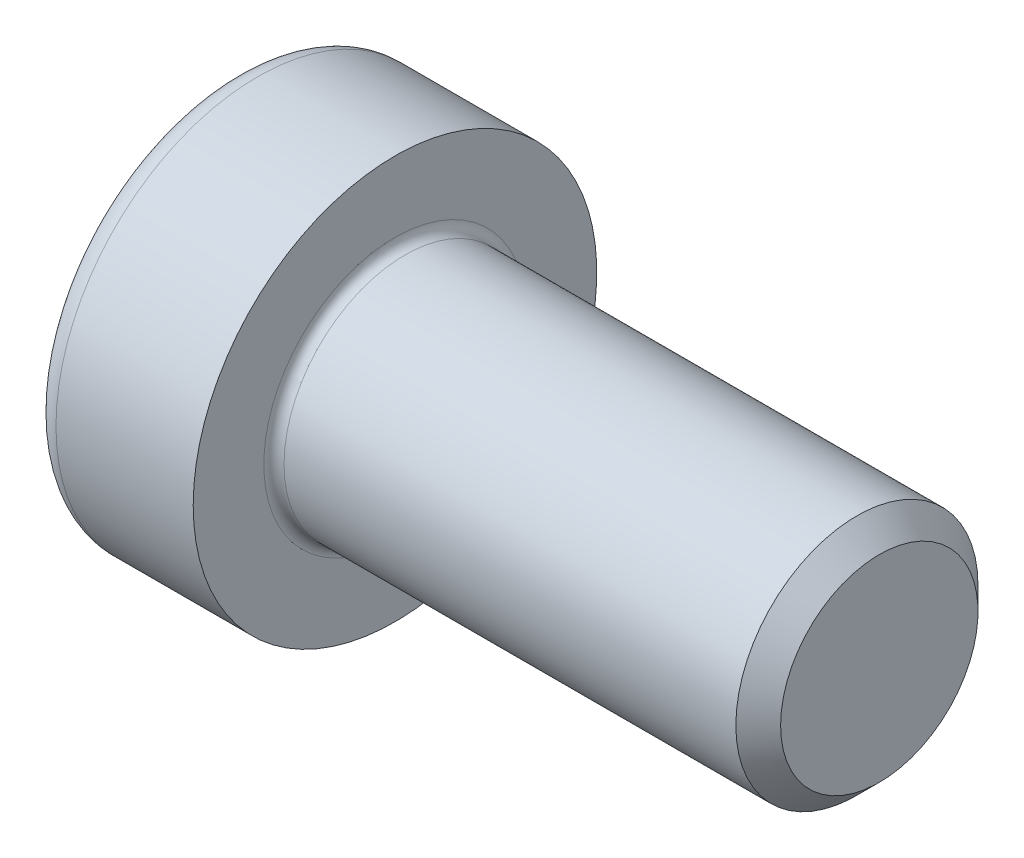
ISO-10303-21;
HEADER;
FILE_DESCRIPTION(('STEP AP214'),'2;1');
FILE_NAME('part.step','',(''),(''),'','','');
FILE_SCHEMA(('AUTOMOTIVE_DESIGN { 1 0 10303 214 1 1 1 1 }'));
ENDSEC;
DATA;
#1=APPLICATION_CONTEXT('core data for automotive mechanical design processes');
#2=APPLICATION_PROTOCOL_DEFINITION('international standard','automotive_design',2000,#1);
#3=PRODUCT_CONTEXT('',#1,'mechanical');
#4=PRODUCT('Part','Part','',(#3));
#5=PRODUCT_RELATED_PRODUCT_CATEGORY('part','',(#4));
#6=PRODUCT_DEFINITION_FORMATION('','',#4);
#7=PRODUCT_DEFINITION_CONTEXT('part definition',#1,'design');
#8=PRODUCT_DEFINITION('design','',#6,#7);
#9=PRODUCT_DEFINITION_SHAPE('','',#8);
#10=(LENGTH_UNIT() NAMED_UNIT(*) SI_UNIT(.MILLI.,.METRE.));
#11=(NAMED_UNIT(*) PLANE_ANGLE_UNIT() SI_UNIT($,.RADIAN.));
#12=(NAMED_UNIT(*) SI_UNIT($,.STERADIAN.) SOLID_ANGLE_UNIT());
#13=UNCERTAINTY_MEASURE_WITH_UNIT(LENGTH_MEASURE(1.E-05),#10,'distance_accuracy_value','');
#14=(GEOMETRIC_REPRESENTATION_CONTEXT(3) GLOBAL_UNCERTAINTY_ASSIGNED_CONTEXT((#13)) GLOBAL_UNIT_ASSIGNED_CONTEXT((#10,
#11,#12)) REPRESENTATION_CONTEXT('',''));
#15=CARTESIAN_POINT('',(0.,0.,0.));
#16=DIRECTION('',(0.,0.,1.));
#17=DIRECTION('',(1.,0.,0.));
#18=AXIS2_PLACEMENT_3D('',#15,#16,#17);
#19=CARTESIAN_POINT('',(2.5,1.44337567297407,2.49999999999999));
#20=DIRECTION('',(-1.,0.,0.));
#21=DIRECTION('',(0.,0.,1.));
#22=AXIS2_PLACEMENT_3D('',#19,#20,#21);
#23=PLANE('',#22);
#24=CARTESIAN_POINT('',(2.5,0.,0.));
#25=DIRECTION('',(-1.,0.,0.));
#26=DIRECTION('',(0.,0.,1.));
#27=AXIS2_PLACEMENT_3D('',#24,#25,#26);
#28=CIRCLE('',#27,2.5);
#29=CARTESIAN_POINT('',(2.5,0.,2.5));
#30=VERTEX_POINT('',#29);
#31=CARTESIAN_POINT('',(2.5,2.1650635094611,1.24999999999999));
#32=VERTEX_POINT('',#31);
#33=EDGE_CURVE('E121',#30,#32,#28,.T.);
#34=ORIENTED_EDGE('',*,*,#33,.F.);
#35=DIRECTION('',(0.,1.,0.));
#36=VECTOR('',#35,1.);
#37=CARTESIAN_POINT('',(2.5,-1.44337567297405,2.5));
#38=LINE('',#37,#36);
#39=CARTESIAN_POINT('',(2.5,1.44337567297408,2.49999999999999));
#40=VERTEX_POINT('',#39);
#41=EDGE_CURVE('E128',#30,#40,#38,.T.);
#42=ORIENTED_EDGE('',*,*,#41,.T.);
#43=DIRECTION('',(0.,-0.499999999999998,0.86602540378444));
#44=VECTOR('',#43,1.);
#45=CARTESIAN_POINT('',(2.5,2.88675134594813,0.));
#46=LINE('',#45,#44);
#47=EDGE_CURVE('E129',#32,#40,#46,.T.);
#48=ORIENTED_EDGE('',*,*,#47,.F.);
#49=EDGE_LOOP('',(#34,#42,#48));
#50=FACE_BOUND('',#49,.T.);
#51=ADVANCED_FACE('F37',(#50),#23,.T.);
#52=CARTESIAN_POINT('',(2.5,0.,0.));
#53=DIRECTION('',(-1.,0.,0.));
#54=DIRECTION('',(0.,0.,1.));
#55=AXIS2_PLACEMENT_3D('',#52,#53,#54);
#56=CIRCLE('',#55,2.5);
#57=CARTESIAN_POINT('',(2.5,2.1650635094611,-1.25));
#58=VERTEX_POINT('',#57);
#59=EDGE_CURVE('E11',#32,#58,#56,.T.);
#60=ORIENTED_EDGE('',*,*,#59,.F.);
#61=CARTESIAN_POINT('',(2.5,2.88675134594813,0.));
#62=VERTEX_POINT('',#61);
#63=EDGE_CURVE('E125',#62,#32,#46,.T.);
#64=ORIENTED_EDGE('',*,*,#63,.F.);
#65=DIRECTION('',(0.,-0.500000000000001,-0.866025403784438));
#66=VECTOR('',#65,1.);
#67=CARTESIAN_POINT('',(2.5,2.88675134594813,0.));
#68=LINE('',#67,#66);
#69=EDGE_CURVE('E146',#62,#58,#68,.T.);
#70=ORIENTED_EDGE('',*,*,#69,.T.);
#71=EDGE_LOOP('',(#60,#64,#70));
#72=FACE_BOUND('',#71,.T.);
#73=ADVANCED_FACE('F250',(#72),#23,.T.);
#74=CARTESIAN_POINT('',(2.5,0.,-2.5));
#75=VERTEX_POINT('',#74);
#76=EDGE_CURVE('E46',#58,#75,#56,.T.);
#77=ORIENTED_EDGE('',*,*,#76,.F.);
#78=CARTESIAN_POINT('',(2.5,1.44337567297407,-2.50000000000001));
#79=VERTEX_POINT('',#78);
#80=EDGE_CURVE('E145',#58,#79,#68,.T.);
#81=ORIENTED_EDGE('',*,*,#80,.T.);
#82=DIRECTION('',(0.,-1.,0.));
#83=VECTOR('',#82,1.);
#84=CARTESIAN_POINT('',(2.5,1.44337567297407,-2.50000000000001));
#85=LINE('',#84,#83);
#86=EDGE_CURVE('E142',#79,#75,#85,.T.);
#87=ORIENTED_EDGE('',*,*,#86,.T.);
#88=EDGE_LOOP('',(#77,#81,#87));
#89=FACE_BOUND('',#88,.T.);
#90=ADVANCED_FACE('F215',(#89),#23,.T.);
#91=CARTESIAN_POINT('',(2.5,-2.1650635094611,-1.24999999999999));
#92=VERTEX_POINT('',#91);
#93=EDGE_CURVE('E199',#75,#92,#56,.T.);
#94=ORIENTED_EDGE('',*,*,#93,.F.);
#95=CARTESIAN_POINT('',(2.5,-1.44337567297406,-2.5));
#96=VERTEX_POINT('',#95);
#97=EDGE_CURVE('E141',#75,#96,#85,.T.);
#98=ORIENTED_EDGE('',*,*,#97,.T.);
#99=DIRECTION('',(0.,0.499999999999998,-0.86602540378444));
#100=VECTOR('',#99,1.);
#101=CARTESIAN_POINT('',(2.5,-2.88675134594812,0.));
#102=LINE('',#101,#100);
#103=EDGE_CURVE('E137',#92,#96,#102,.T.);
#104=ORIENTED_EDGE('',*,*,#103,.F.);
#105=EDGE_LOOP('',(#94,#98,#104));
#106=FACE_BOUND('',#105,.T.);
#107=ADVANCED_FACE('F210',(#106),#23,.T.);
#108=CARTESIAN_POINT('',(2.5,-2.16506350946108,1.25));
#109=VERTEX_POINT('',#108);
#110=EDGE_CURVE('E53',#92,#109,#56,.T.);
#111=ORIENTED_EDGE('',*,*,#110,.F.);
#112=CARTESIAN_POINT('',(2.5,-2.88675134594812,0.));
#113=VERTEX_POINT('',#112);
#114=EDGE_CURVE('E138',#113,#92,#102,.T.);
#115=ORIENTED_EDGE('',*,*,#114,.F.);
#116=DIRECTION('',(0.,-0.500000000000001,-0.866025403784438));
#117=VECTOR('',#116,1.);
#118=CARTESIAN_POINT('',(2.5,-1.44337567297405,2.5));
#119=LINE('',#118,#117);
#120=EDGE_CURVE('E133',#109,#113,#119,.T.);
#121=ORIENTED_EDGE('',*,*,#120,.F.);
#122=EDGE_LOOP('',(#111,#115,#121));
#123=FACE_BOUND('',#122,.T.);
#124=ADVANCED_FACE('F233',(#123),#23,.T.);
#125=CARTESIAN_POINT('',(0.,0.,0.));
#126=DIRECTION('',(-1.,0.,0.));
#127=DIRECTION('',(0.,0.,1.));
#128=AXIS2_PLACEMENT_3D('',#125,#126,#127);
#129=PLANE('',#128);
#130=CARTESIAN_POINT('',(0.,0.,0.));
#131=DIRECTION('',(-1.,0.,0.));
#132=DIRECTION('',(0.,0.,1.));
#133=AXIS2_PLACEMENT_3D('',#130,#131,#132);
#134=CIRCLE('',#133,4.4);
#135=CARTESIAN_POINT('',(0.,0.,4.4));
#136=VERTEX_POINT('',#135);
#137=EDGE_CURVE('E192',#136,#136,#134,.T.);
#138=ORIENTED_EDGE('',*,*,#137,.T.);
#139=EDGE_LOOP('',(#138));
#140=FACE_BOUND('',#139,.T.);
#141=DIRECTION('',(0.,-0.500000000000001,-0.866025403784438));
#142=VECTOR('',#141,1.);
#143=CARTESIAN_POINT('',(0.,2.88675134594813,0.));
#144=LINE('',#143,#142);
#145=CARTESIAN_POINT('',(0.,2.88675134594813,0.));
#146=VERTEX_POINT('',#145);
#147=CARTESIAN_POINT('',(0.,1.44337567297407,-2.50000000000001));
#148=VERTEX_POINT('',#147);
#149=EDGE_CURVE('E161',#146,#148,#144,.T.);
#150=ORIENTED_EDGE('',*,*,#149,.F.);
#151=DIRECTION('',(0.,-0.499999999999998,0.86602540378444));
#152=VECTOR('',#151,1.);
#153=CARTESIAN_POINT('',(0.,2.88675134594813,0.));
#154=LINE('',#153,#152);
#155=CARTESIAN_POINT('',(0.,1.44337567297408,2.49999999999999));
#156=VERTEX_POINT('',#155);
#157=EDGE_CURVE('E61',#146,#156,#154,.T.);
#158=ORIENTED_EDGE('',*,*,#157,.T.);
#159=DIRECTION('',(0.,1.,0.));
#160=VECTOR('',#159,1.);
#161=CARTESIAN_POINT('',(0.,-1.44337567297405,2.5));
#162=LINE('',#161,#160);
#163=CARTESIAN_POINT('',(0.,-1.44337567297405,2.5));
#164=VERTEX_POINT('',#163);
#165=EDGE_CURVE('E151',#164,#156,#162,.T.);
#166=ORIENTED_EDGE('',*,*,#165,.F.);
#167=DIRECTION('',(0.,-0.500000000000001,-0.866025403784438));
#168=VECTOR('',#167,1.);
#169=CARTESIAN_POINT('',(0.,-1.44337567297405,2.5));
#170=LINE('',#169,#168);
#171=CARTESIAN_POINT('',(0.,-2.88675134594812,0.));
#172=VERTEX_POINT('',#171);
#173=EDGE_CURVE('E154',#164,#172,#170,.T.);
#174=ORIENTED_EDGE('',*,*,#173,.T.);
#175=DIRECTION('',(0.,0.499999999999998,-0.86602540378444));
#176=VECTOR('',#175,1.);
#177=CARTESIAN_POINT('',(0.,-2.88675134594812,0.));
#178=LINE('',#177,#176);
#179=CARTESIAN_POINT('',(0.,-1.44337567297406,-2.5));
#180=VERTEX_POINT('',#179);
#181=EDGE_CURVE('E156',#172,#180,#178,.T.);
#182=ORIENTED_EDGE('',*,*,#181,.T.);
#183=DIRECTION('',(0.,-1.,0.));
#184=VECTOR('',#183,1.);
#185=CARTESIAN_POINT('',(0.,1.44337567297407,-2.50000000000001));
#186=LINE('',#185,#184);
#187=EDGE_CURVE('E158',#148,#180,#186,.T.);
#188=ORIENTED_EDGE('',*,*,#187,.F.);
#189=EDGE_LOOP('',(#150,#158,#166,#174,#182,#188));
#190=FACE_BOUND('',#189,.T.);
#191=ADVANCED_FACE('F223',(#140,#190),#129,.T.);
#192=CARTESIAN_POINT('',(-31.75,0.,0.));
#193=DIRECTION('',(-1.,0.,0.));
#194=DIRECTION('',(0.,0.,1.));
#195=AXIS2_PLACEMENT_3D('',#192,#193,#194);
#196=CYLINDRICAL_SURFACE('',#195,5.);
#197=CARTESIAN_POINT('',(0.600000000000003,0.,0.));
#198=DIRECTION('',(-1.,0.,0.));
#199=DIRECTION('',(0.,0.,1.));
#200=AXIS2_PLACEMENT_3D('',#197,#198,#199);
#201=CIRCLE('',#200,5.);
#202=CARTESIAN_POINT('',(0.600000000000003,0.,5.));
#203=VERTEX_POINT('',#202);
#204=EDGE_CURVE('E194',#203,#203,#201,.F.);
#205=ORIENTED_EDGE('',*,*,#204,.T.);
#206=EDGE_LOOP('',(#205));
#207=FACE_BOUND('',#206,.T.);
#208=CARTESIAN_POINT('',(4.,0.,0.));
#209=DIRECTION('',(-1.,0.,0.));
#210=DIRECTION('',(0.,0.,1.));
#211=AXIS2_PLACEMENT_3D('',#208,#209,#210);
#212=CIRCLE('',#211,5.);
#213=CARTESIAN_POINT('',(4.,0.,5.));
#214=VERTEX_POINT('',#213);
#215=EDGE_CURVE('E183',#214,#214,#212,.T.);
#216=ORIENTED_EDGE('',*,*,#215,.T.);
#217=EDGE_LOOP('',(#216));
#218=FACE_BOUND('',#217,.T.);
#219=ADVANCED_FACE('F289',(#207,#218),#196,.T.);
#220=CARTESIAN_POINT('',(4.,5.,0.));
#221=DIRECTION('',(1.,0.,0.));
#222=DIRECTION('',(0.,0.,-1.));
#223=AXIS2_PLACEMENT_3D('',#220,#221,#222);
#224=PLANE('',#223);
#225=CARTESIAN_POINT('',(4.,0.,0.));
#226=DIRECTION('',(1.,0.,0.));
#227=DIRECTION('',(0.,0.,-1.));
#228=AXIS2_PLACEMENT_3D('',#225,#226,#227);
#229=CIRCLE('',#228,3.24999999999996);
#230=CARTESIAN_POINT('',(4.,0.,-3.24999999999996));
#231=VERTEX_POINT('',#230);
#232=EDGE_CURVE('E186',#231,#231,#229,.F.);
#233=ORIENTED_EDGE('',*,*,#232,.T.);
#234=EDGE_LOOP('',(#233));
#235=FACE_BOUND('',#234,.T.);
#236=ORIENTED_EDGE('',*,*,#215,.F.);
#237=EDGE_LOOP('',(#236));
#238=FACE_BOUND('',#237,.T.);
#239=ADVANCED_FACE('F285',(#235,#238),#224,.T.);
#240=CARTESIAN_POINT('',(-31.75,0.,0.));
#241=DIRECTION('',(-1.,0.,0.));
#242=DIRECTION('',(0.,0.,1.));
#243=AXIS2_PLACEMENT_3D('',#240,#241,#242);
#244=CYLINDRICAL_SURFACE('',#243,2.99999999999996);
#245=CARTESIAN_POINT('',(4.25,0.,0.));
#246=DIRECTION('',(1.,0.,0.));
#247=DIRECTION('',(0.,0.,-1.));
#248=AXIS2_PLACEMENT_3D('',#245,#246,#247);
#249=CIRCLE('',#248,2.99999999999996);
#250=CARTESIAN_POINT('',(4.25,0.,-2.99999999999996));
#251=VERTEX_POINT('',#250);
#252=EDGE_CURVE('E189',#251,#251,#249,.T.);
#253=ORIENTED_EDGE('',*,*,#252,.T.);
#254=EDGE_LOOP('',(#253));
#255=FACE_BOUND('',#254,.T.);
#256=CARTESIAN_POINT('',(15.4454999999999,0.,0.));
#257=DIRECTION('',(-1.,0.,0.));
#258=DIRECTION('',(0.,0.,1.));
#259=AXIS2_PLACEMENT_3D('',#256,#257,#258);
#260=CIRCLE('',#259,2.99999999999991);
#261=CARTESIAN_POINT('',(15.4454999999999,0.,2.99999999999991));
#262=VERTEX_POINT('',#261);
#263=EDGE_CURVE('E180',#262,#262,#260,.T.);
#264=ORIENTED_EDGE('',*,*,#263,.T.);
#265=EDGE_LOOP('',(#264));
#266=FACE_BOUND('',#265,.T.);
#267=ADVANCED_FACE('F281',(#255,#266),#244,.T.);
#268=CARTESIAN_POINT('',(16.,0.,0.));
#269=DIRECTION('',(-1.,0.,0.));
#270=DIRECTION('',(0.,0.,1.));
#271=AXIS2_PLACEMENT_3D('',#268,#269,#270);
#272=CONICAL_SURFACE('',#271,2.4455,0.785398163397296);
#273=ORIENTED_EDGE('',*,*,#263,.F.);
#274=EDGE_LOOP('',(#273));
#275=FACE_BOUND('',#274,.T.);
#276=CARTESIAN_POINT('',(16.,0.,0.));
#277=DIRECTION('',(-1.,0.,0.));
#278=DIRECTION('',(0.,0.,1.));
#279=AXIS2_PLACEMENT_3D('',#276,#277,#278);
#280=CIRCLE('',#279,2.4455);
#281=CARTESIAN_POINT('',(16.,0.,2.4455));
#282=VERTEX_POINT('',#281);
#283=EDGE_CURVE('E177',#282,#282,#280,.T.);
#284=ORIENTED_EDGE('',*,*,#283,.T.);
#285=EDGE_LOOP('',(#284));
#286=FACE_BOUND('',#285,.T.);
#287=ADVANCED_FACE('F277',(#275,#286),#272,.T.);
#288=CARTESIAN_POINT('',(16.,2.4455,0.));
#289=DIRECTION('',(1.,0.,0.));
#290=DIRECTION('',(0.,0.,-1.));
#291=AXIS2_PLACEMENT_3D('',#288,#289,#290);
#292=PLANE('',#291);
#293=ORIENTED_EDGE('',*,*,#283,.F.);
#294=EDGE_LOOP('',(#293));
#295=FACE_BOUND('',#294,.T.);
#296=ADVANCED_FACE('F273',(#295),#292,.T.);
#297=CARTESIAN_POINT('',(4.25,0.,0.));
#298=DIRECTION('',(1.,0.,0.));
#299=DIRECTION('',(0.,0.,-1.));
#300=AXIS2_PLACEMENT_3D('',#297,#298,#299);
#301=TOROIDAL_SURFACE('',#300,3.24999999999996,0.25);
#302=ORIENTED_EDGE('',*,*,#252,.F.);
#303=EDGE_LOOP('',(#302));
#304=FACE_BOUND('',#303,.T.);
#305=ORIENTED_EDGE('',*,*,#232,.F.);
#306=EDGE_LOOP('',(#305));
#307=FACE_BOUND('',#306,.T.);
#308=ADVANCED_FACE('F276',(#304,#307),#301,.F.);
#309=CARTESIAN_POINT('',(0.600000000000003,0.,0.));
#310=DIRECTION('',(-1.,0.,0.));
#311=DIRECTION('',(0.,0.,1.));
#312=AXIS2_PLACEMENT_3D('',#309,#310,#311);
#313=TOROIDAL_SURFACE('',#312,4.4,0.6);
#314=ORIENTED_EDGE('',*,*,#204,.F.);
#315=EDGE_LOOP('',(#314));
#316=FACE_BOUND('',#315,.T.);
#317=ORIENTED_EDGE('',*,*,#137,.F.);
#318=EDGE_LOOP('',(#317));
#319=FACE_BOUND('',#318,.T.);
#320=ADVANCED_FACE('F39',(#316,#319),#313,.T.);
#321=CARTESIAN_POINT('',(2.5,2.88675134594813,0.));
#322=DIRECTION('',(0.,-0.86602540378444,-0.499999999999998));
#323=DIRECTION('',(0.,0.499999999999998,-0.86602540378444));
#324=AXIS2_PLACEMENT_3D('',#321,#322,#323);
#325=PLANE('',#324);
#326=DIRECTION('',(-1.,0.,0.));
#327=VECTOR('',#326,1.);
#328=CARTESIAN_POINT('',(2.5,1.44337567297408,2.49999999999999));
#329=LINE('',#328,#327);
#330=EDGE_CURVE('E175',#40,#156,#329,.T.);
#331=ORIENTED_EDGE('',*,*,#330,.T.);
#332=ORIENTED_EDGE('',*,*,#157,.F.);
#333=DIRECTION('',(-1.,0.,0.));
#334=VECTOR('',#333,1.);
#335=CARTESIAN_POINT('',(2.5,2.88675134594813,0.));
#336=LINE('',#335,#334);
#337=EDGE_CURVE('E149',#62,#146,#336,.T.);
#338=ORIENTED_EDGE('',*,*,#337,.F.);
#339=ORIENTED_EDGE('',*,*,#63,.T.);
#340=ORIENTED_EDGE('',*,*,#47,.T.);
#341=EDGE_LOOP('',(#331,#332,#338,#339,#340));
#342=FACE_BOUND('',#341,.T.);
#343=ADVANCED_FACE('F247',(#342),#325,.T.);
#344=CARTESIAN_POINT('',(2.5,-1.44337567297405,2.5));
#345=DIRECTION('',(0.,0.,1.));
#346=DIRECTION('',(0.,-1.,0.));
#347=AXIS2_PLACEMENT_3D('',#344,#345,#346);
#348=PLANE('',#347);
#349=ORIENTED_EDGE('',*,*,#41,.F.);
#350=CARTESIAN_POINT('',(2.5,-1.44337567297405,2.5));
#351=VERTEX_POINT('',#350);
#352=EDGE_CURVE('E130',#351,#30,#38,.T.);
#353=ORIENTED_EDGE('',*,*,#352,.F.);
#354=DIRECTION('',(-1.,0.,0.));
#355=VECTOR('',#354,1.);
#356=CARTESIAN_POINT('',(2.5,-1.44337567297405,2.5));
#357=LINE('',#356,#355);
#358=EDGE_CURVE('E173',#351,#164,#357,.T.);
#359=ORIENTED_EDGE('',*,*,#358,.T.);
#360=ORIENTED_EDGE('',*,*,#165,.T.);
#361=ORIENTED_EDGE('',*,*,#330,.F.);
#362=EDGE_LOOP('',(#349,#353,#359,#360,#361));
#363=FACE_BOUND('',#362,.T.);
#364=ADVANCED_FACE('F242',(#363),#348,.F.);
#365=CARTESIAN_POINT('',(2.5,-1.44337567297405,2.5));
#366=DIRECTION('',(0.,0.866025403784438,-0.500000000000001));
#367=DIRECTION('',(0.,0.500000000000001,0.866025403784438));
#368=AXIS2_PLACEMENT_3D('',#365,#366,#367);
#369=PLANE('',#368);
#370=DIRECTION('',(-1.,0.,0.));
#371=VECTOR('',#370,1.);
#372=CARTESIAN_POINT('',(2.5,-2.88675134594812,0.));
#373=LINE('',#372,#371);
#374=EDGE_CURVE('E170',#113,#172,#373,.T.);
#375=ORIENTED_EDGE('',*,*,#374,.T.);
#376=ORIENTED_EDGE('',*,*,#173,.F.);
#377=ORIENTED_EDGE('',*,*,#358,.F.);
#378=EDGE_CURVE('E134',#351,#109,#119,.T.);
#379=ORIENTED_EDGE('',*,*,#378,.T.);
#380=ORIENTED_EDGE('',*,*,#120,.T.);
#381=EDGE_LOOP('',(#375,#376,#377,#379,#380));
#382=FACE_BOUND('',#381,.T.);
#383=ADVANCED_FACE('F236',(#382),#369,.T.);
#384=CARTESIAN_POINT('',(2.5,-2.88675134594812,0.));
#385=DIRECTION('',(0.,0.86602540378444,0.499999999999998));
#386=DIRECTION('',(0.,-0.499999999999998,0.86602540378444));
#387=AXIS2_PLACEMENT_3D('',#384,#385,#386);
#388=PLANE('',#387);
#389=DIRECTION('',(-1.,0.,0.));
#390=VECTOR('',#389,1.);
#391=CARTESIAN_POINT('',(2.5,-1.44337567297406,-2.5));
#392=LINE('',#391,#390);
#393=EDGE_CURVE('E167',#96,#180,#392,.T.);
#394=ORIENTED_EDGE('',*,*,#393,.T.);
#395=ORIENTED_EDGE('',*,*,#181,.F.);
#396=ORIENTED_EDGE('',*,*,#374,.F.);
#397=ORIENTED_EDGE('',*,*,#114,.T.);
#398=ORIENTED_EDGE('',*,*,#103,.T.);
#399=EDGE_LOOP('',(#394,#395,#396,#397,#398));
#400=FACE_BOUND('',#399,.T.);
#401=ADVANCED_FACE('F229',(#400),#388,.T.);
#402=CARTESIAN_POINT('',(2.5,1.44337567297407,-2.50000000000001));
#403=DIRECTION('',(0.,0.,-1.));
#404=DIRECTION('',(0.,1.,0.));
#405=AXIS2_PLACEMENT_3D('',#402,#403,#404);
#406=PLANE('',#405);
#407=ORIENTED_EDGE('',*,*,#97,.F.);
#408=ORIENTED_EDGE('',*,*,#86,.F.);
#409=DIRECTION('',(-1.,0.,0.));
#410=VECTOR('',#409,1.);
#411=CARTESIAN_POINT('',(2.5,1.44337567297407,-2.50000000000001));
#412=LINE('',#411,#410);
#413=EDGE_CURVE('E164',#79,#148,#412,.T.);
#414=ORIENTED_EDGE('',*,*,#413,.T.);
#415=ORIENTED_EDGE('',*,*,#187,.T.);
#416=ORIENTED_EDGE('',*,*,#393,.F.);
#417=EDGE_LOOP('',(#407,#408,#414,#415,#416));
#418=FACE_BOUND('',#417,.T.);
#419=ADVANCED_FACE('F214',(#418),#406,.F.);
#420=CARTESIAN_POINT('',(2.5,2.88675134594813,0.));
#421=DIRECTION('',(0.,0.866025403784438,-0.500000000000001));
#422=DIRECTION('',(0.,0.500000000000001,0.866025403784438));
#423=AXIS2_PLACEMENT_3D('',#420,#421,#422);
#424=PLANE('',#423);
#425=ORIENTED_EDGE('',*,*,#80,.F.);
#426=ORIENTED_EDGE('',*,*,#69,.F.);
#427=ORIENTED_EDGE('',*,*,#337,.T.);
#428=ORIENTED_EDGE('',*,*,#149,.T.);
#429=ORIENTED_EDGE('',*,*,#413,.F.);
#430=EDGE_LOOP('',(#425,#426,#427,#428,#429));
#431=FACE_BOUND('',#430,.T.);
#432=ADVANCED_FACE('F219',(#431),#424,.F.);
#433=EDGE_CURVE('E41',#109,#30,#56,.T.);
#434=ORIENTED_EDGE('',*,*,#433,.F.);
#435=ORIENTED_EDGE('',*,*,#378,.F.);
#436=ORIENTED_EDGE('',*,*,#352,.T.);
#437=EDGE_LOOP('',(#434,#435,#436));
#438=FACE_BOUND('',#437,.T.);
#439=ADVANCED_FACE('F239',(#438),#23,.T.);
#440=CARTESIAN_POINT('',(2.5,0.,0.));
#441=DIRECTION('',(-1.,0.,0.));
#442=DIRECTION('',(0.,0.,1.));
#443=AXIS2_PLACEMENT_3D('',#440,#441,#442);
#444=CONICAL_SURFACE('',#443,2.5,1.04719755119659);
#445=CARTESIAN_POINT('',(3.07735026918963,0.,0.));
#446=DIRECTION('',(-1.,0.,0.));
#447=DIRECTION('',(0.,0.,1.));
#448=AXIS2_PLACEMENT_3D('',#445,#446,#447);
#449=CIRCLE('',#448,1.5);
#450=CARTESIAN_POINT('',(3.07735026918963,0.,1.5));
#451=VERTEX_POINT('',#450);
#452=EDGE_CURVE('E118',#451,#451,#449,.T.);
#453=ORIENTED_EDGE('',*,*,#452,.F.);
#454=EDGE_LOOP('',(#453));
#455=FACE_BOUND('',#454,.T.);
#456=ORIENTED_EDGE('',*,*,#33,.T.);
#457=ORIENTED_EDGE('',*,*,#59,.T.);
#458=ORIENTED_EDGE('',*,*,#76,.T.);
#459=ORIENTED_EDGE('',*,*,#93,.T.);
#460=ORIENTED_EDGE('',*,*,#110,.T.);
#461=ORIENTED_EDGE('',*,*,#433,.T.);
#462=EDGE_LOOP('',(#456,#457,#458,#459,#460,#461));
#463=FACE_BOUND('',#462,.T.);
#464=ADVANCED_FACE('F202',(#455,#463),#444,.F.);
#465=CARTESIAN_POINT('',(0.,0.,0.));
#466=DIRECTION('',(-1.,0.,0.));
#467=DIRECTION('',(0.,0.,1.));
#468=AXIS2_PLACEMENT_3D('',#465,#466,#467);
#469=CYLINDRICAL_SURFACE('',#468,1.5);
#470=CARTESIAN_POINT('',(5.,0.,0.));
#471=DIRECTION('',(-1.,0.,0.));
#472=DIRECTION('',(0.,0.,1.));
#473=AXIS2_PLACEMENT_3D('',#470,#471,#472);
#474=CIRCLE('',#473,1.5);
#475=CARTESIAN_POINT('',(5.,0.,1.5));
#476=VERTEX_POINT('',#475);
#477=EDGE_CURVE('E116',#476,#476,#474,.T.);
#478=ORIENTED_EDGE('',*,*,#477,.F.);
#479=EDGE_LOOP('',(#478));
#480=FACE_BOUND('',#479,.T.);
#481=ORIENTED_EDGE('',*,*,#452,.T.);
#482=EDGE_LOOP('',(#481));
#483=FACE_BOUND('',#482,.T.);
#484=ADVANCED_FACE('F112',(#480,#483),#469,.F.);
#485=CARTESIAN_POINT('',(5.,0.,0.));
#486=DIRECTION('',(-1.,0.,0.));
#487=DIRECTION('',(0.,0.,1.));
#488=AXIS2_PLACEMENT_3D('',#485,#486,#487);
#489=CONICAL_SURFACE('',#488,1.5,1.04719755119659);
#490=CARTESIAN_POINT('',(5.86602540378445,0.,0.));
#491=VERTEX_POINT('',#490);
#492=VERTEX_LOOP('',#491);
#493=FACE_BOUND('',#492,.T.);
#494=ORIENTED_EDGE('',*,*,#477,.T.);
#495=EDGE_LOOP('',(#494));
#496=FACE_BOUND('',#495,.T.);
#497=ADVANCED_FACE('F109',(#493,#496),#489,.F.);
#498=CLOSED_SHELL('',(#51,#73,#90,#107,#124,#191,#219,#239,#267,#287,#296,#308,#320,#343,#364,
#383,#401,#419,#432,#439,#464,#484,#497));
#499=MANIFOLD_SOLID_BREP('B2',#498);
#500=ADVANCED_BREP_SHAPE_REPRESENTATION('',(#18,#499),#14);
#501=SHAPE_DEFINITION_REPRESENTATION(#9,#500);
ENDSEC;
END-ISO-10303-21;
